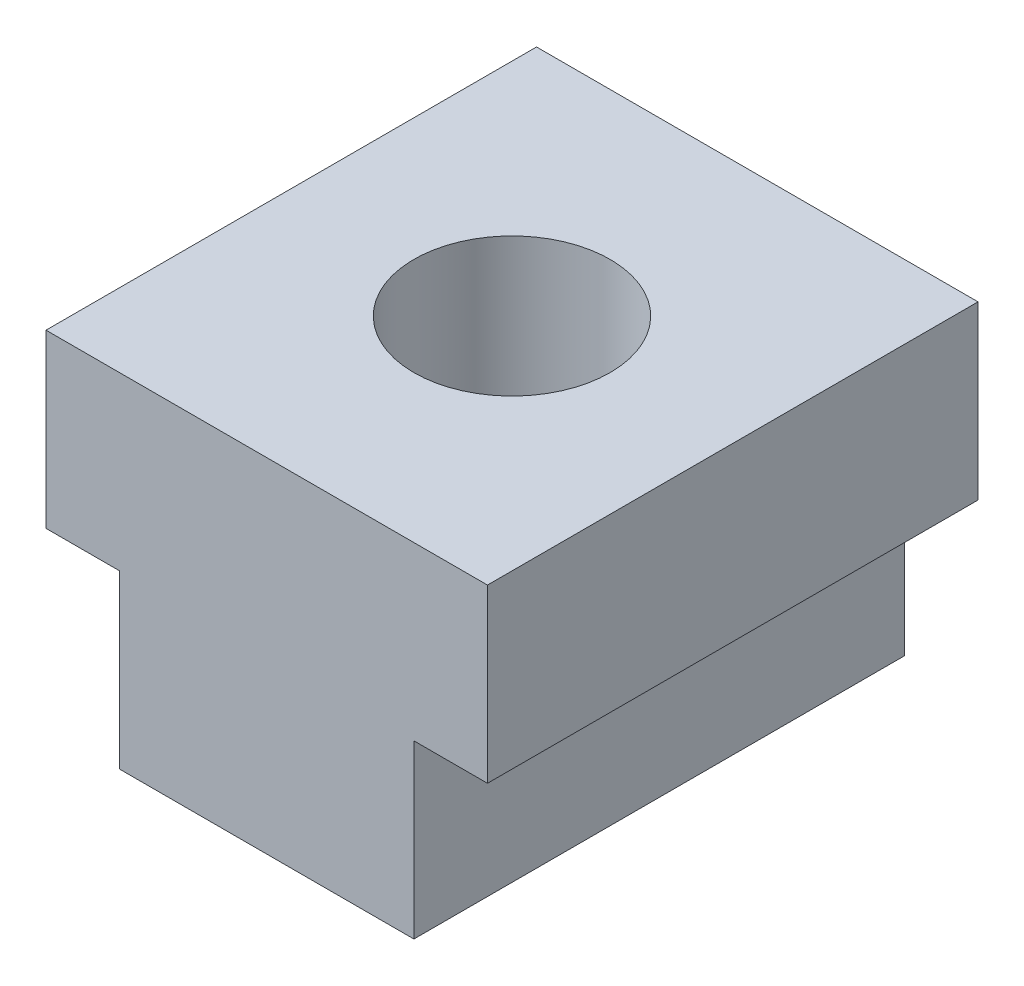
ISO-10303-21;
HEADER;
FILE_DESCRIPTION(('STEP AP214'),'2;1');
FILE_NAME('part.step','',(''),(''),'','','');
FILE_SCHEMA(('AUTOMOTIVE_DESIGN { 1 0 10303 214 1 1 1 1 }'));
ENDSEC;
DATA;
#1=APPLICATION_CONTEXT('core data for automotive mechanical design processes');
#2=APPLICATION_PROTOCOL_DEFINITION('international standard','automotive_design',2000,#1);
#3=PRODUCT_CONTEXT('',#1,'mechanical');
#4=PRODUCT('Part','Part','',(#3));
#5=PRODUCT_RELATED_PRODUCT_CATEGORY('part','',(#4));
#6=PRODUCT_DEFINITION_FORMATION('','',#4);
#7=PRODUCT_DEFINITION_CONTEXT('part definition',#1,'design');
#8=PRODUCT_DEFINITION('design','',#6,#7);
#9=PRODUCT_DEFINITION_SHAPE('','',#8);
#10=(LENGTH_UNIT() NAMED_UNIT(*) SI_UNIT(.MILLI.,.METRE.));
#11=(NAMED_UNIT(*) PLANE_ANGLE_UNIT() SI_UNIT($,.RADIAN.));
#12=(NAMED_UNIT(*) SI_UNIT($,.STERADIAN.) SOLID_ANGLE_UNIT());
#13=UNCERTAINTY_MEASURE_WITH_UNIT(LENGTH_MEASURE(1.E-05),#10,'distance_accuracy_value','');
#14=(GEOMETRIC_REPRESENTATION_CONTEXT(3) GLOBAL_UNCERTAINTY_ASSIGNED_CONTEXT((#13)) GLOBAL_UNIT_ASSIGNED_CONTEXT((#10,
#11,#12)) REPRESENTATION_CONTEXT('',''));
#15=CARTESIAN_POINT('',(0.,0.,0.));
#16=DIRECTION('',(0.,0.,1.));
#17=DIRECTION('',(1.,0.,0.));
#18=AXIS2_PLACEMENT_3D('',#15,#16,#17);
#19=CARTESIAN_POINT('',(0.,9.08158979444465,-10.));
#20=DIRECTION('',(0.,-1.,0.));
#21=DIRECTION('',(0.,0.,-1.));
#22=AXIS2_PLACEMENT_3D('',#19,#20,#21);
#23=CYLINDRICAL_SURFACE('',#22,4.);
#24=CARTESIAN_POINT('',(0.,-10.5,-10.));
#25=DIRECTION('',(0.,1.,0.));
#26=DIRECTION('',(1.,0.,0.));
#27=AXIS2_PLACEMENT_3D('',#24,#25,#26);
#28=CIRCLE('',#27,4.);
#29=CARTESIAN_POINT('',(4.,-10.5,-10.));
#30=VERTEX_POINT('',#29);
#31=EDGE_CURVE('E171',#30,#30,#28,.T.);
#32=ORIENTED_EDGE('',*,*,#31,.F.);
#33=EDGE_LOOP('',(#32));
#34=FACE_BOUND('',#33,.T.);
#35=CARTESIAN_POINT('',(0.,3.5,-10.));
#36=DIRECTION('',(0.,-1.,0.));
#37=DIRECTION('',(0.,0.,1.));
#38=AXIS2_PLACEMENT_3D('',#35,#36,#37);
#39=CIRCLE('',#38,4.);
#40=CARTESIAN_POINT('',(0.,3.5,-6.));
#41=VERTEX_POINT('',#40);
#42=EDGE_CURVE('E35',#41,#41,#39,.T.);
#43=ORIENTED_EDGE('',*,*,#42,.F.);
#44=EDGE_LOOP('',(#43));
#45=FACE_BOUND('',#44,.T.);
#46=ADVANCED_FACE('F17',(#34,#45),#23,.F.);
#47=CARTESIAN_POINT('',(0.,0.,0.));
#48=DIRECTION('',(0.,0.,1.));
#49=DIRECTION('',(1.,0.,0.));
#50=AXIS2_PLACEMENT_3D('',#47,#48,#49);
#51=PLANE('',#50);
#52=DIRECTION('',(-1.,0.,0.));
#53=VECTOR('',#52,1.);
#54=CARTESIAN_POINT('',(9.,3.5,0.));
#55=LINE('',#54,#53);
#56=CARTESIAN_POINT('',(9.,3.5,0.));
#57=VERTEX_POINT('',#56);
#58=CARTESIAN_POINT('',(-9.,3.5,0.));
#59=VERTEX_POINT('',#58);
#60=EDGE_CURVE('E25',#57,#59,#55,.T.);
#61=ORIENTED_EDGE('',*,*,#60,.T.);
#62=DIRECTION('',(0.,-1.,0.));
#63=VECTOR('',#62,1.);
#64=CARTESIAN_POINT('',(-9.,3.5,0.));
#65=LINE('',#64,#63);
#66=CARTESIAN_POINT('',(-9.,-3.5,0.));
#67=VERTEX_POINT('',#66);
#68=EDGE_CURVE('E113',#59,#67,#65,.T.);
#69=ORIENTED_EDGE('',*,*,#68,.T.);
#70=DIRECTION('',(1.,0.,0.));
#71=VECTOR('',#70,1.);
#72=CARTESIAN_POINT('',(-9.,-3.5,0.));
#73=LINE('',#72,#71);
#74=CARTESIAN_POINT('',(-6.,-3.5,0.));
#75=VERTEX_POINT('',#74);
#76=EDGE_CURVE('E139',#67,#75,#73,.T.);
#77=ORIENTED_EDGE('',*,*,#76,.T.);
#78=DIRECTION('',(0.,-1.,0.));
#79=VECTOR('',#78,1.);
#80=CARTESIAN_POINT('',(-6.,-3.5,0.));
#81=LINE('',#80,#79);
#82=CARTESIAN_POINT('',(-6.,-10.5,0.));
#83=VERTEX_POINT('',#82);
#84=EDGE_CURVE('E155',#75,#83,#81,.T.);
#85=ORIENTED_EDGE('',*,*,#84,.T.);
#86=DIRECTION('',(1.,0.,0.));
#87=VECTOR('',#86,1.);
#88=CARTESIAN_POINT('',(-6.,-10.5,0.));
#89=LINE('',#88,#87);
#90=CARTESIAN_POINT('',(6.,-10.5,0.));
#91=VERTEX_POINT('',#90);
#92=EDGE_CURVE('E178',#83,#91,#89,.T.);
#93=ORIENTED_EDGE('',*,*,#92,.T.);
#94=DIRECTION('',(0.,1.,0.));
#95=VECTOR('',#94,1.);
#96=CARTESIAN_POINT('',(6.,-10.5,0.));
#97=LINE('',#96,#95);
#98=CARTESIAN_POINT('',(6.,-3.5,0.));
#99=VERTEX_POINT('',#98);
#100=EDGE_CURVE('E164',#91,#99,#97,.T.);
#101=ORIENTED_EDGE('',*,*,#100,.T.);
#102=DIRECTION('',(1.,0.,0.));
#103=VECTOR('',#102,1.);
#104=CARTESIAN_POINT('',(6.,-3.5,0.));
#105=LINE('',#104,#103);
#106=CARTESIAN_POINT('',(9.,-3.5,0.));
#107=VERTEX_POINT('',#106);
#108=EDGE_CURVE('E145',#99,#107,#105,.T.);
#109=ORIENTED_EDGE('',*,*,#108,.T.);
#110=DIRECTION('',(0.,1.,0.));
#111=VECTOR('',#110,1.);
#112=CARTESIAN_POINT('',(9.,-3.5,0.));
#113=LINE('',#112,#111);
#114=EDGE_CURVE('E115',#107,#57,#113,.T.);
#115=ORIENTED_EDGE('',*,*,#114,.T.);
#116=EDGE_LOOP('',(#61,#69,#77,#85,#93,#101,#109,#115));
#117=FACE_BOUND('',#116,.T.);
#118=ADVANCED_FACE('F110',(#117),#51,.T.);
#119=CARTESIAN_POINT('',(0.,0.,-20.));
#120=DIRECTION('',(0.,0.,1.));
#121=DIRECTION('',(1.,0.,0.));
#122=AXIS2_PLACEMENT_3D('',#119,#120,#121);
#123=PLANE('',#122);
#124=DIRECTION('',(-1.,0.,0.));
#125=VECTOR('',#124,1.);
#126=CARTESIAN_POINT('',(-6.,3.5,-20.));
#127=LINE('',#126,#125);
#128=CARTESIAN_POINT('',(9.,3.5,-20.));
#129=VERTEX_POINT('',#128);
#130=CARTESIAN_POINT('',(-9.,3.5,-20.));
#131=VERTEX_POINT('',#130);
#132=EDGE_CURVE('E11',#129,#131,#127,.T.);
#133=ORIENTED_EDGE('',*,*,#132,.F.);
#134=DIRECTION('',(0.,1.,0.));
#135=VECTOR('',#134,1.);
#136=CARTESIAN_POINT('',(9.,-3.5,-20.));
#137=LINE('',#136,#135);
#138=CARTESIAN_POINT('',(9.,-3.5,-20.));
#139=VERTEX_POINT('',#138);
#140=EDGE_CURVE('E201',#139,#129,#137,.T.);
#141=ORIENTED_EDGE('',*,*,#140,.F.);
#142=DIRECTION('',(1.,0.,0.));
#143=VECTOR('',#142,1.);
#144=CARTESIAN_POINT('',(6.,-3.5,-20.));
#145=LINE('',#144,#143);
#146=CARTESIAN_POINT('',(6.,-3.5,-20.));
#147=VERTEX_POINT('',#146);
#148=EDGE_CURVE('E148',#147,#139,#145,.T.);
#149=ORIENTED_EDGE('',*,*,#148,.F.);
#150=DIRECTION('',(0.,1.,0.));
#151=VECTOR('',#150,1.);
#152=CARTESIAN_POINT('',(6.,-10.5,-20.));
#153=LINE('',#152,#151);
#154=CARTESIAN_POINT('',(6.,-10.5,-20.));
#155=VERTEX_POINT('',#154);
#156=EDGE_CURVE('E160',#155,#147,#153,.T.);
#157=ORIENTED_EDGE('',*,*,#156,.F.);
#158=DIRECTION('',(1.,0.,0.));
#159=VECTOR('',#158,1.);
#160=CARTESIAN_POINT('',(-6.,-10.5,-20.));
#161=LINE('',#160,#159);
#162=CARTESIAN_POINT('',(-6.,-10.5,-20.));
#163=VERTEX_POINT('',#162);
#164=EDGE_CURVE('E182',#163,#155,#161,.T.);
#165=ORIENTED_EDGE('',*,*,#164,.F.);
#166=DIRECTION('',(0.,-1.,0.));
#167=VECTOR('',#166,1.);
#168=CARTESIAN_POINT('',(-6.,-3.5,-20.));
#169=LINE('',#168,#167);
#170=CARTESIAN_POINT('',(-6.,-3.5,-20.));
#171=VERTEX_POINT('',#170);
#172=EDGE_CURVE('E150',#171,#163,#169,.T.);
#173=ORIENTED_EDGE('',*,*,#172,.F.);
#174=DIRECTION('',(1.,0.,0.));
#175=VECTOR('',#174,1.);
#176=CARTESIAN_POINT('',(-9.,-3.5,-20.));
#177=LINE('',#176,#175);
#178=CARTESIAN_POINT('',(-9.,-3.5,-20.));
#179=VERTEX_POINT('',#178);
#180=EDGE_CURVE('E142',#179,#171,#177,.T.);
#181=ORIENTED_EDGE('',*,*,#180,.F.);
#182=DIRECTION('',(0.,-1.,0.));
#183=VECTOR('',#182,1.);
#184=CARTESIAN_POINT('',(-9.,3.5,-20.));
#185=LINE('',#184,#183);
#186=EDGE_CURVE('E126',#131,#179,#185,.T.);
#187=ORIENTED_EDGE('',*,*,#186,.F.);
#188=EDGE_LOOP('',(#133,#141,#149,#157,#165,#173,#181,#187));
#189=FACE_BOUND('',#188,.T.);
#190=ADVANCED_FACE('F292',(#189),#123,.F.);
#191=CARTESIAN_POINT('',(9.,3.5,-20.));
#192=DIRECTION('',(0.,1.,0.));
#193=DIRECTION('',(1.,0.,0.));
#194=AXIS2_PLACEMENT_3D('',#191,#192,#193);
#195=PLANE('',#194);
#196=ORIENTED_EDGE('',*,*,#60,.F.);
#197=DIRECTION('',(0.,0.,1.));
#198=VECTOR('',#197,1.);
#199=CARTESIAN_POINT('',(9.,3.5,-20.));
#200=LINE('',#199,#198);
#201=EDGE_CURVE('E205',#129,#57,#200,.T.);
#202=ORIENTED_EDGE('',*,*,#201,.F.);
#203=ORIENTED_EDGE('',*,*,#132,.T.);
#204=DIRECTION('',(0.,0.,1.));
#205=VECTOR('',#204,1.);
#206=CARTESIAN_POINT('',(-9.,3.5,-20.));
#207=LINE('',#206,#205);
#208=EDGE_CURVE('E121',#131,#59,#207,.T.);
#209=ORIENTED_EDGE('',*,*,#208,.T.);
#210=EDGE_LOOP('',(#196,#202,#203,#209));
#211=FACE_BOUND('',#210,.T.);
#212=ORIENTED_EDGE('',*,*,#42,.T.);
#213=EDGE_LOOP('',(#212));
#214=FACE_BOUND('',#213,.T.);
#215=ADVANCED_FACE('F122',(#211,#214),#195,.T.);
#216=CARTESIAN_POINT('',(9.,-3.5,-20.));
#217=DIRECTION('',(1.,0.,0.));
#218=DIRECTION('',(0.,1.,0.));
#219=AXIS2_PLACEMENT_3D('',#216,#217,#218);
#220=PLANE('',#219);
#221=ORIENTED_EDGE('',*,*,#114,.F.);
#222=DIRECTION('',(0.,0.,1.));
#223=VECTOR('',#222,1.);
#224=CARTESIAN_POINT('',(9.,-3.5,-20.));
#225=LINE('',#224,#223);
#226=EDGE_CURVE('E172',#139,#107,#225,.T.);
#227=ORIENTED_EDGE('',*,*,#226,.F.);
#228=ORIENTED_EDGE('',*,*,#140,.T.);
#229=ORIENTED_EDGE('',*,*,#201,.T.);
#230=EDGE_LOOP('',(#221,#227,#228,#229));
#231=FACE_BOUND('',#230,.T.);
#232=ADVANCED_FACE('F307',(#231),#220,.T.);
#233=CARTESIAN_POINT('',(6.,-3.5,-20.));
#234=DIRECTION('',(0.,-1.,0.));
#235=DIRECTION('',(-1.,0.,0.));
#236=AXIS2_PLACEMENT_3D('',#233,#234,#235);
#237=PLANE('',#236);
#238=ORIENTED_EDGE('',*,*,#108,.F.);
#239=DIRECTION('',(0.,0.,1.));
#240=VECTOR('',#239,1.);
#241=CARTESIAN_POINT('',(6.,-3.5,-20.));
#242=LINE('',#241,#240);
#243=EDGE_CURVE('E149',#147,#99,#242,.T.);
#244=ORIENTED_EDGE('',*,*,#243,.F.);
#245=ORIENTED_EDGE('',*,*,#148,.T.);
#246=ORIENTED_EDGE('',*,*,#226,.T.);
#247=EDGE_LOOP('',(#238,#244,#245,#246));
#248=FACE_BOUND('',#247,.T.);
#249=ADVANCED_FACE('F304',(#248),#237,.T.);
#250=CARTESIAN_POINT('',(6.,-10.5,-20.));
#251=DIRECTION('',(1.,0.,0.));
#252=DIRECTION('',(0.,1.,0.));
#253=AXIS2_PLACEMENT_3D('',#250,#251,#252);
#254=PLANE('',#253);
#255=ORIENTED_EDGE('',*,*,#100,.F.);
#256=DIRECTION('',(0.,0.,1.));
#257=VECTOR('',#256,1.);
#258=CARTESIAN_POINT('',(6.,-10.5,-20.));
#259=LINE('',#258,#257);
#260=EDGE_CURVE('E186',#155,#91,#259,.T.);
#261=ORIENTED_EDGE('',*,*,#260,.F.);
#262=ORIENTED_EDGE('',*,*,#156,.T.);
#263=ORIENTED_EDGE('',*,*,#243,.T.);
#264=EDGE_LOOP('',(#255,#261,#262,#263));
#265=FACE_BOUND('',#264,.T.);
#266=ADVANCED_FACE('F301',(#265),#254,.T.);
#267=CARTESIAN_POINT('',(-6.,-10.5,-20.));
#268=DIRECTION('',(0.,-1.,0.));
#269=DIRECTION('',(0.,0.,-1.));
#270=AXIS2_PLACEMENT_3D('',#267,#268,#269);
#271=PLANE('',#270);
#272=ORIENTED_EDGE('',*,*,#92,.F.);
#273=DIRECTION('',(0.,0.,1.));
#274=VECTOR('',#273,1.);
#275=CARTESIAN_POINT('',(-6.,-10.5,-20.));
#276=LINE('',#275,#274);
#277=EDGE_CURVE('E154',#163,#83,#276,.T.);
#278=ORIENTED_EDGE('',*,*,#277,.F.);
#279=ORIENTED_EDGE('',*,*,#164,.T.);
#280=ORIENTED_EDGE('',*,*,#260,.T.);
#281=EDGE_LOOP('',(#272,#278,#279,#280));
#282=FACE_BOUND('',#281,.T.);
#283=ORIENTED_EDGE('',*,*,#31,.T.);
#284=EDGE_LOOP('',(#283));
#285=FACE_BOUND('',#284,.T.);
#286=ADVANCED_FACE('F297',(#282,#285),#271,.T.);
#287=CARTESIAN_POINT('',(-6.,-3.5,-20.));
#288=DIRECTION('',(-1.,0.,0.));
#289=DIRECTION('',(0.,0.,1.));
#290=AXIS2_PLACEMENT_3D('',#287,#288,#289);
#291=PLANE('',#290);
#292=ORIENTED_EDGE('',*,*,#84,.F.);
#293=DIRECTION('',(0.,0.,1.));
#294=VECTOR('',#293,1.);
#295=CARTESIAN_POINT('',(-6.,-3.5,-20.));
#296=LINE('',#295,#294);
#297=EDGE_CURVE('E156',#171,#75,#296,.T.);
#298=ORIENTED_EDGE('',*,*,#297,.F.);
#299=ORIENTED_EDGE('',*,*,#172,.T.);
#300=ORIENTED_EDGE('',*,*,#277,.T.);
#301=EDGE_LOOP('',(#292,#298,#299,#300));
#302=FACE_BOUND('',#301,.T.);
#303=ADVANCED_FACE('F295',(#302),#291,.T.);
#304=CARTESIAN_POINT('',(-9.,-3.5,-20.));
#305=DIRECTION('',(0.,-1.,0.));
#306=DIRECTION('',(0.,0.,-1.));
#307=AXIS2_PLACEMENT_3D('',#304,#305,#306);
#308=PLANE('',#307);
#309=ORIENTED_EDGE('',*,*,#76,.F.);
#310=DIRECTION('',(0.,0.,1.));
#311=VECTOR('',#310,1.);
#312=CARTESIAN_POINT('',(-9.,-3.5,-20.));
#313=LINE('',#312,#311);
#314=EDGE_CURVE('E131',#179,#67,#313,.T.);
#315=ORIENTED_EDGE('',*,*,#314,.F.);
#316=ORIENTED_EDGE('',*,*,#180,.T.);
#317=ORIENTED_EDGE('',*,*,#297,.T.);
#318=EDGE_LOOP('',(#309,#315,#316,#317));
#319=FACE_BOUND('',#318,.T.);
#320=ADVANCED_FACE('F290',(#319),#308,.T.);
#321=CARTESIAN_POINT('',(-9.,3.5,-20.));
#322=DIRECTION('',(-1.,0.,0.));
#323=DIRECTION('',(0.,0.,1.));
#324=AXIS2_PLACEMENT_3D('',#321,#322,#323);
#325=PLANE('',#324);
#326=ORIENTED_EDGE('',*,*,#68,.F.);
#327=ORIENTED_EDGE('',*,*,#208,.F.);
#328=ORIENTED_EDGE('',*,*,#186,.T.);
#329=ORIENTED_EDGE('',*,*,#314,.T.);
#330=EDGE_LOOP('',(#326,#327,#328,#329));
#331=FACE_BOUND('',#330,.T.);
#332=ADVANCED_FACE('F129',(#331),#325,.T.);
#333=CLOSED_SHELL('',(#46,#118,#190,#215,#232,#249,#266,#286,#303,#320,#332));
#334=MANIFOLD_SOLID_BREP('B1',#333);
#335=ADVANCED_BREP_SHAPE_REPRESENTATION('',(#18,#334),#14);
#336=SHAPE_DEFINITION_REPRESENTATION(#9,#335);
ENDSEC;
END-ISO-10303-21;
